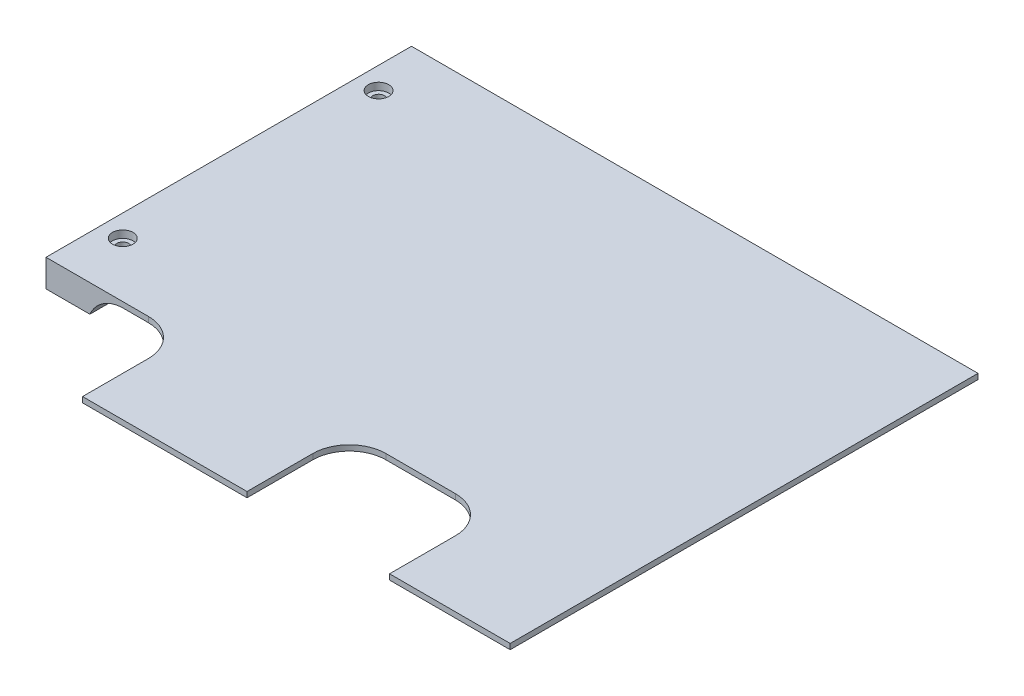
ISO-10303-21;
HEADER;
FILE_DESCRIPTION(('STEP AP214'),'2;1');
FILE_NAME('part.step','',(''),(''),'','','');
FILE_SCHEMA(('AUTOMOTIVE_DESIGN { 1 0 10303 214 1 1 1 1 }'));
ENDSEC;
DATA;
#1=APPLICATION_CONTEXT('core data for automotive mechanical design processes');
#2=APPLICATION_PROTOCOL_DEFINITION('international standard','automotive_design',2000,#1);
#3=PRODUCT_CONTEXT('',#1,'mechanical');
#4=PRODUCT('Part','Part','',(#3));
#5=PRODUCT_RELATED_PRODUCT_CATEGORY('part','',(#4));
#6=PRODUCT_DEFINITION_FORMATION('','',#4);
#7=PRODUCT_DEFINITION_CONTEXT('part definition',#1,'design');
#8=PRODUCT_DEFINITION('design','',#6,#7);
#9=PRODUCT_DEFINITION_SHAPE('','',#8);
#10=(LENGTH_UNIT() NAMED_UNIT(*) SI_UNIT(.MILLI.,.METRE.));
#11=(NAMED_UNIT(*) PLANE_ANGLE_UNIT() SI_UNIT($,.RADIAN.));
#12=(NAMED_UNIT(*) SI_UNIT($,.STERADIAN.) SOLID_ANGLE_UNIT());
#13=UNCERTAINTY_MEASURE_WITH_UNIT(LENGTH_MEASURE(1.E-05),#10,'distance_accuracy_value','');
#14=(GEOMETRIC_REPRESENTATION_CONTEXT(3) GLOBAL_UNCERTAINTY_ASSIGNED_CONTEXT((#13)) GLOBAL_UNIT_ASSIGNED_CONTEXT((#10,
#11,#12)) REPRESENTATION_CONTEXT('',''));
#15=CARTESIAN_POINT('',(0.,0.,0.));
#16=DIRECTION('',(0.,0.,1.));
#17=DIRECTION('',(1.,0.,0.));
#18=AXIS2_PLACEMENT_3D('',#15,#16,#17);
#19=CARTESIAN_POINT('',(5.99999999999995,-4.52548339959391,-15.));
#20=DIRECTION('',(0.,1.,0.));
#21=DIRECTION('',(0.,0.,1.));
#22=AXIS2_PLACEMENT_3D('',#19,#20,#21);
#23=CYLINDRICAL_SURFACE('',#22,1.6);
#24=CARTESIAN_POINT('',(5.99999999999995,-6.,-15.));
#25=DIRECTION('',(0.,-1.,0.));
#26=DIRECTION('',(0.,0.,-1.));
#27=AXIS2_PLACEMENT_3D('',#24,#25,#26);
#28=CIRCLE('',#27,1.6);
#29=CARTESIAN_POINT('',(5.99999999999995,-6.,-13.4));
#30=VERTEX_POINT('',#29);
#31=EDGE_CURVE('E222',#30,#30,#28,.T.);
#32=CARTESIAN_POINT('',(5.99999999999995,-0.5,-15.));
#33=DIRECTION('',(0.,1.,0.));
#34=DIRECTION('',(0.,0.,1.));
#35=AXIS2_PLACEMENT_3D('',#32,#33,#34);
#36=CIRCLE('',#35,1.6);
#37=CARTESIAN_POINT('',(5.99999999999995,-0.500000000000001,-13.4));
#38=VERTEX_POINT('',#37);
#39=EDGE_CURVE('E43',#38,#38,#36,.F.);
#40=CARTESIAN_POINT('',(5.99999999999995,-6.,-13.4));
#41=CARTESIAN_POINT('',(5.99999999999995,-5.94270833333333,-13.4));
#42=CARTESIAN_POINT('',(5.99999999999995,-5.88541666666667,-13.4));
#43=CARTESIAN_POINT('',(5.99999999999995,-5.77083333333333,-13.4));
#44=CARTESIAN_POINT('',(5.99999999999995,-5.71354166666667,-13.4));
#45=CARTESIAN_POINT('',(5.99999999999995,-5.59895833333333,-13.4));
#46=CARTESIAN_POINT('',(5.99999999999995,-5.54166666666667,-13.4));
#47=CARTESIAN_POINT('',(5.99999999999995,-5.42708333333333,-13.4));
#48=CARTESIAN_POINT('',(5.99999999999995,-5.36979166666667,-13.4));
#49=CARTESIAN_POINT('',(5.99999999999995,-5.25520833333333,-13.4));
#50=CARTESIAN_POINT('',(5.99999999999995,-5.19791666666667,-13.4));
#51=CARTESIAN_POINT('',(5.99999999999995,-5.08333333333333,-13.4));
#52=CARTESIAN_POINT('',(5.99999999999995,-5.02604166666667,-13.4));
#53=CARTESIAN_POINT('',(5.99999999999995,-4.91145833333333,-13.4));
#54=CARTESIAN_POINT('',(5.99999999999995,-4.85416666666667,-13.4));
#55=CARTESIAN_POINT('',(5.99999999999995,-4.73958333333333,-13.4));
#56=CARTESIAN_POINT('',(5.99999999999995,-4.68229166666667,-13.4));
#57=CARTESIAN_POINT('',(5.99999999999995,-4.56770833333333,-13.4));
#58=CARTESIAN_POINT('',(5.99999999999995,-4.51041666666667,-13.4));
#59=CARTESIAN_POINT('',(5.99999999999995,-4.39583333333333,-13.4));
#60=CARTESIAN_POINT('',(5.99999999999995,-4.33854166666667,-13.4));
#61=CARTESIAN_POINT('',(5.99999999999995,-4.22395833333333,-13.4));
#62=CARTESIAN_POINT('',(5.99999999999995,-4.16666666666667,-13.4));
#63=CARTESIAN_POINT('',(5.99999999999995,-4.05208333333333,-13.4));
#64=CARTESIAN_POINT('',(5.99999999999995,-3.99479166666667,-13.4));
#65=CARTESIAN_POINT('',(5.99999999999995,-3.88020833333333,-13.4));
#66=CARTESIAN_POINT('',(5.99999999999995,-3.82291666666667,-13.4));
#67=CARTESIAN_POINT('',(5.99999999999995,-3.70833333333333,-13.4));
#68=CARTESIAN_POINT('',(5.99999999999995,-3.65104166666667,-13.4));
#69=CARTESIAN_POINT('',(5.99999999999995,-3.53645833333333,-13.4));
#70=CARTESIAN_POINT('',(5.99999999999995,-3.47916666666667,-13.4));
#71=CARTESIAN_POINT('',(5.99999999999995,-3.36458333333333,-13.4));
#72=CARTESIAN_POINT('',(5.99999999999995,-3.30729166666667,-13.4));
#73=CARTESIAN_POINT('',(5.99999999999995,-3.19270833333333,-13.4));
#74=CARTESIAN_POINT('',(5.99999999999995,-3.13541666666667,-13.4));
#75=CARTESIAN_POINT('',(5.99999999999995,-3.02083333333333,-13.4));
#76=CARTESIAN_POINT('',(5.99999999999995,-2.96354166666667,-13.4));
#77=CARTESIAN_POINT('',(5.99999999999995,-2.84895833333333,-13.4));
#78=CARTESIAN_POINT('',(5.99999999999995,-2.79166666666667,-13.4));
#79=CARTESIAN_POINT('',(5.99999999999995,-2.67708333333333,-13.4));
#80=CARTESIAN_POINT('',(5.99999999999995,-2.61979166666667,-13.4));
#81=CARTESIAN_POINT('',(5.99999999999995,-2.50520833333333,-13.4));
#82=CARTESIAN_POINT('',(5.99999999999995,-2.44791666666667,-13.4));
#83=CARTESIAN_POINT('',(5.99999999999995,-2.33333333333333,-13.4));
#84=CARTESIAN_POINT('',(5.99999999999995,-2.27604166666667,-13.4));
#85=CARTESIAN_POINT('',(5.99999999999995,-2.16145833333333,-13.4));
#86=CARTESIAN_POINT('',(5.99999999999995,-2.10416666666667,-13.4));
#87=CARTESIAN_POINT('',(5.99999999999995,-1.98958333333333,-13.4));
#88=CARTESIAN_POINT('',(5.99999999999995,-1.93229166666667,-13.4));
#89=CARTESIAN_POINT('',(5.99999999999995,-1.81770833333333,-13.4));
#90=CARTESIAN_POINT('',(5.99999999999995,-1.76041666666667,-13.4));
#91=CARTESIAN_POINT('',(5.99999999999995,-1.64583333333333,-13.4));
#92=CARTESIAN_POINT('',(5.99999999999995,-1.58854166666667,-13.4));
#93=CARTESIAN_POINT('',(5.99999999999995,-1.47395833333333,-13.4));
#94=CARTESIAN_POINT('',(5.99999999999995,-1.41666666666667,-13.4));
#95=CARTESIAN_POINT('',(5.99999999999995,-1.30208333333333,-13.4));
#96=CARTESIAN_POINT('',(5.99999999999995,-1.24479166666667,-13.4));
#97=CARTESIAN_POINT('',(5.99999999999995,-1.13020833333333,-13.4));
#98=CARTESIAN_POINT('',(5.99999999999995,-1.07291666666667,-13.4));
#99=CARTESIAN_POINT('',(5.99999999999995,-0.958333333333334,-13.4));
#100=CARTESIAN_POINT('',(5.99999999999995,-0.901041666666667,-13.4));
#101=CARTESIAN_POINT('',(5.99999999999995,-0.786458333333334,-13.4));
#102=CARTESIAN_POINT('',(5.99999999999995,-0.729166666666667,-13.4));
#103=CARTESIAN_POINT('',(5.99999999999995,-0.614583333333334,-13.4));
#104=CARTESIAN_POINT('',(5.99999999999995,-0.557291666666668,-13.4));
#105=CARTESIAN_POINT('',(5.99999999999995,-0.500000000000001,-13.4));
#106=B_SPLINE_CURVE_WITH_KNOTS('',3,(#40,#41,#42,#43,#44,#45,#46,#47,#48,#49,#50,#51,#52,#53,
#54,#55,#56,#57,#58,#59,#60,#61,#62,#63,#64,#65,#66,#67,#68,#69,#70,#71,#72,#73,#74,#75,#76,#77,
#78,#79,#80,#81,#82,#83,#84,#85,#86,#87,#88,#89,#90,#91,#92,#93,#94,#95,#96,#97,#98,#99,#100,
#101,#102,#103,#104,#105),.UNSPECIFIED.,.F.,.F.,(4,2,2,2,2,2,2,2,2,2,2,2,2,2,2,2,2,2,2,2,2,2,2,
2,2,2,2,2,2,2,2,2,4),(0.,0.171874999999999,0.343749999999999,0.515625,0.6875,0.859375,1.03125,
1.203125,1.375,1.546875,1.71875,1.890625,2.0625,2.234375,2.40625,2.578125,2.75,2.921875,3.09375,
3.265625,3.4375,3.609375,3.78125,3.953125,4.125,4.296875,4.46875,4.640625,4.8125,4.984375,
5.15625,5.328125,5.5),.UNSPECIFIED.);
#107=EDGE_CURVE('BSEAM39',#30,#38,#106,.T.);
#108=ORIENTED_EDGE('',*,*,#31,.T.);
#109=ORIENTED_EDGE('',*,*,#39,.F.);
#110=ORIENTED_EDGE('',*,*,#107,.T.);
#111=ORIENTED_EDGE('',*,*,#107,.F.);
#112=EDGE_LOOP('',(#108,#110,#109,#111));
#113=FACE_BOUND('',#112,.T.);
#114=ADVANCED_FACE('F39',(#113),#23,.F.);
#115=CARTESIAN_POINT('',(5.99999999999995,-4.52548339959391,-85.));
#116=DIRECTION('',(0.,1.,0.));
#117=DIRECTION('',(0.,0.,1.));
#118=AXIS2_PLACEMENT_3D('',#115,#116,#117);
#119=CYLINDRICAL_SURFACE('',#118,1.6);
#120=CARTESIAN_POINT('',(5.99999999999995,-6.,-85.));
#121=DIRECTION('',(0.,-1.,0.));
#122=DIRECTION('',(0.,0.,-1.));
#123=AXIS2_PLACEMENT_3D('',#120,#121,#122);
#124=CIRCLE('',#123,1.60000000000001);
#125=CARTESIAN_POINT('',(5.99999999999995,-6.,-83.4));
#126=VERTEX_POINT('',#125);
#127=EDGE_CURVE('E219',#126,#126,#124,.T.);
#128=CARTESIAN_POINT('',(5.99999999999995,-0.5,-85.));
#129=DIRECTION('',(0.,1.,0.));
#130=DIRECTION('',(0.,0.,1.));
#131=AXIS2_PLACEMENT_3D('',#128,#129,#130);
#132=CIRCLE('',#131,1.6);
#133=CARTESIAN_POINT('',(5.99999999999995,-0.500000000000001,-83.4));
#134=VERTEX_POINT('',#133);
#135=EDGE_CURVE('E287',#134,#134,#132,.F.);
#136=CARTESIAN_POINT('',(5.99999999999995,-6.,-83.4));
#137=CARTESIAN_POINT('',(5.99999999999995,-5.94270833333333,-83.4));
#138=CARTESIAN_POINT('',(5.99999999999995,-5.88541666666667,-83.4));
#139=CARTESIAN_POINT('',(5.99999999999995,-5.77083333333333,-83.4));
#140=CARTESIAN_POINT('',(5.99999999999995,-5.71354166666667,-83.4));
#141=CARTESIAN_POINT('',(5.99999999999995,-5.59895833333333,-83.4));
#142=CARTESIAN_POINT('',(5.99999999999995,-5.54166666666667,-83.4));
#143=CARTESIAN_POINT('',(5.99999999999995,-5.42708333333333,-83.4));
#144=CARTESIAN_POINT('',(5.99999999999995,-5.36979166666667,-83.4));
#145=CARTESIAN_POINT('',(5.99999999999995,-5.25520833333333,-83.4));
#146=CARTESIAN_POINT('',(5.99999999999995,-5.19791666666667,-83.4));
#147=CARTESIAN_POINT('',(5.99999999999995,-5.08333333333333,-83.4));
#148=CARTESIAN_POINT('',(5.99999999999995,-5.02604166666667,-83.4));
#149=CARTESIAN_POINT('',(5.99999999999995,-4.91145833333333,-83.4));
#150=CARTESIAN_POINT('',(5.99999999999995,-4.85416666666667,-83.4));
#151=CARTESIAN_POINT('',(5.99999999999995,-4.73958333333333,-83.4));
#152=CARTESIAN_POINT('',(5.99999999999995,-4.68229166666667,-83.4));
#153=CARTESIAN_POINT('',(5.99999999999995,-4.56770833333333,-83.4));
#154=CARTESIAN_POINT('',(5.99999999999995,-4.51041666666667,-83.4));
#155=CARTESIAN_POINT('',(5.99999999999995,-4.39583333333333,-83.4));
#156=CARTESIAN_POINT('',(5.99999999999995,-4.33854166666667,-83.4));
#157=CARTESIAN_POINT('',(5.99999999999995,-4.22395833333333,-83.4));
#158=CARTESIAN_POINT('',(5.99999999999995,-4.16666666666667,-83.4));
#159=CARTESIAN_POINT('',(5.99999999999995,-4.05208333333333,-83.4));
#160=CARTESIAN_POINT('',(5.99999999999995,-3.99479166666667,-83.4));
#161=CARTESIAN_POINT('',(5.99999999999995,-3.88020833333333,-83.4));
#162=CARTESIAN_POINT('',(5.99999999999995,-3.82291666666667,-83.4));
#163=CARTESIAN_POINT('',(5.99999999999995,-3.70833333333333,-83.4));
#164=CARTESIAN_POINT('',(5.99999999999995,-3.65104166666667,-83.4));
#165=CARTESIAN_POINT('',(5.99999999999995,-3.53645833333333,-83.4));
#166=CARTESIAN_POINT('',(5.99999999999995,-3.47916666666667,-83.4));
#167=CARTESIAN_POINT('',(5.99999999999995,-3.36458333333333,-83.4));
#168=CARTESIAN_POINT('',(5.99999999999995,-3.30729166666667,-83.4));
#169=CARTESIAN_POINT('',(5.99999999999995,-3.19270833333333,-83.4));
#170=CARTESIAN_POINT('',(5.99999999999995,-3.13541666666667,-83.4));
#171=CARTESIAN_POINT('',(5.99999999999995,-3.02083333333333,-83.4));
#172=CARTESIAN_POINT('',(5.99999999999995,-2.96354166666667,-83.4));
#173=CARTESIAN_POINT('',(5.99999999999995,-2.84895833333333,-83.4));
#174=CARTESIAN_POINT('',(5.99999999999995,-2.79166666666667,-83.4));
#175=CARTESIAN_POINT('',(5.99999999999995,-2.67708333333333,-83.4));
#176=CARTESIAN_POINT('',(5.99999999999995,-2.61979166666667,-83.4));
#177=CARTESIAN_POINT('',(5.99999999999995,-2.50520833333333,-83.4));
#178=CARTESIAN_POINT('',(5.99999999999995,-2.44791666666667,-83.4));
#179=CARTESIAN_POINT('',(5.99999999999995,-2.33333333333333,-83.4));
#180=CARTESIAN_POINT('',(5.99999999999995,-2.27604166666667,-83.4));
#181=CARTESIAN_POINT('',(5.99999999999995,-2.16145833333333,-83.4));
#182=CARTESIAN_POINT('',(5.99999999999995,-2.10416666666667,-83.4));
#183=CARTESIAN_POINT('',(5.99999999999995,-1.98958333333333,-83.4));
#184=CARTESIAN_POINT('',(5.99999999999995,-1.93229166666667,-83.4));
#185=CARTESIAN_POINT('',(5.99999999999995,-1.81770833333333,-83.4));
#186=CARTESIAN_POINT('',(5.99999999999995,-1.76041666666667,-83.4));
#187=CARTESIAN_POINT('',(5.99999999999995,-1.64583333333333,-83.4));
#188=CARTESIAN_POINT('',(5.99999999999995,-1.58854166666667,-83.4));
#189=CARTESIAN_POINT('',(5.99999999999995,-1.47395833333333,-83.4));
#190=CARTESIAN_POINT('',(5.99999999999995,-1.41666666666667,-83.4));
#191=CARTESIAN_POINT('',(5.99999999999995,-1.30208333333333,-83.4));
#192=CARTESIAN_POINT('',(5.99999999999995,-1.24479166666667,-83.4));
#193=CARTESIAN_POINT('',(5.99999999999995,-1.13020833333333,-83.4));
#194=CARTESIAN_POINT('',(5.99999999999995,-1.07291666666667,-83.4));
#195=CARTESIAN_POINT('',(5.99999999999995,-0.958333333333334,-83.4));
#196=CARTESIAN_POINT('',(5.99999999999995,-0.901041666666667,-83.4));
#197=CARTESIAN_POINT('',(5.99999999999995,-0.786458333333334,-83.4));
#198=CARTESIAN_POINT('',(5.99999999999995,-0.729166666666667,-83.4));
#199=CARTESIAN_POINT('',(5.99999999999995,-0.614583333333334,-83.4));
#200=CARTESIAN_POINT('',(5.99999999999995,-0.557291666666668,-83.4));
#201=CARTESIAN_POINT('',(5.99999999999995,-0.500000000000001,-83.4));
#202=B_SPLINE_CURVE_WITH_KNOTS('',3,(#136,#137,#138,#139,#140,#141,#142,#143,#144,#145,#146,
#147,#148,#149,#150,#151,#152,#153,#154,#155,#156,#157,#158,#159,#160,#161,#162,#163,#164,#165,
#166,#167,#168,#169,#170,#171,#172,#173,#174,#175,#176,#177,#178,#179,#180,#181,#182,#183,#184,
#185,#186,#187,#188,#189,#190,#191,#192,#193,#194,#195,#196,#197,#198,#199,#200,#201),
.UNSPECIFIED.,.F.,.F.,(4,2,2,2,2,2,2,2,2,2,2,2,2,2,2,2,2,2,2,2,2,2,2,2,2,2,2,2,2,2,2,2,4),(0.,
0.171874999999999,0.343749999999999,0.515625,0.6875,0.859375,1.03125,1.203125,1.375,1.546875,
1.71875,1.890625,2.0625,2.234375,2.40625,2.578125,2.75,2.921875,3.09375,3.265625,3.4375,
3.609375,3.78125,3.953125,4.125,4.296875,4.46875,4.640625,4.8125,4.984375,5.15625,5.328125,5.5),.UNSPECIFIED.);
#203=EDGE_CURVE('BSEAM325',#126,#134,#202,.T.);
#204=ORIENTED_EDGE('',*,*,#127,.T.);
#205=ORIENTED_EDGE('',*,*,#135,.F.);
#206=ORIENTED_EDGE('',*,*,#203,.T.);
#207=ORIENTED_EDGE('',*,*,#203,.F.);
#208=EDGE_LOOP('',(#204,#206,#205,#207));
#209=FACE_BOUND('',#208,.T.);
#210=ADVANCED_FACE('F325',(#209),#119,.F.);
#211=CARTESIAN_POINT('',(0.,1.5,0.));
#212=DIRECTION('',(0.,0.,-1.));
#213=DIRECTION('',(-1.,0.,0.));
#214=AXIS2_PLACEMENT_3D('',#211,#212,#213);
#215=PLANE('',#214);
#216=DIRECTION('',(1.,0.,0.));
#217=VECTOR('',#216,1.);
#218=CARTESIAN_POINT('',(0.,1.5,0.));
#219=LINE('',#218,#217);
#220=CARTESIAN_POINT('',(92.9999999999999,1.5,0.));
#221=VERTEX_POINT('',#220);
#222=CARTESIAN_POINT('',(112.,1.5,0.));
#223=VERTEX_POINT('',#222);
#224=EDGE_CURVE('E240',#221,#223,#219,.T.);
#225=ORIENTED_EDGE('',*,*,#224,.F.);
#226=DIRECTION('',(0.,1.,0.));
#227=VECTOR('',#226,1.);
#228=CARTESIAN_POINT('',(92.9999999999999,1.5,0.));
#229=LINE('',#228,#227);
#230=CARTESIAN_POINT('',(92.9999999999999,0.,0.));
#231=VERTEX_POINT('',#230);
#232=EDGE_CURVE('E267',#221,#231,#229,.F.);
#233=ORIENTED_EDGE('',*,*,#232,.T.);
#234=DIRECTION('',(1.,0.,0.));
#235=VECTOR('',#234,1.);
#236=CARTESIAN_POINT('',(0.,0.,0.));
#237=LINE('',#236,#235);
#238=CARTESIAN_POINT('',(112.,0.,0.));
#239=VERTEX_POINT('',#238);
#240=EDGE_CURVE('E237',#231,#239,#237,.T.);
#241=ORIENTED_EDGE('',*,*,#240,.T.);
#242=DIRECTION('',(0.,1.,0.));
#243=VECTOR('',#242,1.);
#244=CARTESIAN_POINT('',(112.,1.5,0.));
#245=LINE('',#244,#243);
#246=EDGE_CURVE('E264',#239,#223,#245,.T.);
#247=ORIENTED_EDGE('',*,*,#246,.T.);
#248=EDGE_LOOP('',(#225,#233,#241,#247));
#249=FACE_BOUND('',#248,.T.);
#250=ADVANCED_FACE('F330',(#249),#215,.F.);
#251=CARTESIAN_POINT('',(0.,1.5,0.));
#252=DIRECTION('',(1.,0.,0.));
#253=DIRECTION('',(0.,0.,-1.));
#254=AXIS2_PLACEMENT_3D('',#251,#252,#253);
#255=PLANE('',#254);
#256=DIRECTION('',(0.,-1.,0.));
#257=VECTOR('',#256,1.);
#258=CARTESIAN_POINT('',(0.,1.5,-100.));
#259=LINE('',#258,#257);
#260=CARTESIAN_POINT('',(0.,1.5,-100.));
#261=VERTEX_POINT('',#260);
#262=CARTESIAN_POINT('',(0.,-6.,-100.));
#263=VERTEX_POINT('',#262);
#264=EDGE_CURVE('E245',#261,#263,#259,.T.);
#265=ORIENTED_EDGE('',*,*,#264,.T.);
#266=DIRECTION('',(0.,0.,-1.));
#267=VECTOR('',#266,1.);
#268=CARTESIAN_POINT('',(0.,-6.,-100.));
#269=LINE('',#268,#267);
#270=CARTESIAN_POINT('',(0.,-6.,0.));
#271=VERTEX_POINT('',#270);
#272=EDGE_CURVE('E225',#271,#263,#269,.T.);
#273=ORIENTED_EDGE('',*,*,#272,.F.);
#274=DIRECTION('',(0.,-1.,0.));
#275=VECTOR('',#274,1.);
#276=CARTESIAN_POINT('',(0.,1.5,0.));
#277=LINE('',#276,#275);
#278=CARTESIAN_POINT('',(0.,1.5,0.));
#279=VERTEX_POINT('',#278);
#280=EDGE_CURVE('E253',#279,#271,#277,.T.);
#281=ORIENTED_EDGE('',*,*,#280,.F.);
#282=DIRECTION('',(0.,0.,1.));
#283=VECTOR('',#282,1.);
#284=CARTESIAN_POINT('',(0.,1.5,0.));
#285=LINE('',#284,#283);
#286=EDGE_CURVE('E238',#261,#279,#285,.T.);
#287=ORIENTED_EDGE('',*,*,#286,.F.);
#288=EDGE_LOOP('',(#265,#273,#281,#287));
#289=FACE_BOUND('',#288,.T.);
#290=ADVANCED_FACE('F387',(#289),#255,.F.);
#291=DIRECTION('',(-1.,0.,0.));
#292=VECTOR('',#291,1.);
#293=CARTESIAN_POINT('',(0.,-6.,0.));
#294=LINE('',#293,#292);
#295=CARTESIAN_POINT('',(11.9999999999999,-6.,0.));
#296=VERTEX_POINT('',#295);
#297=EDGE_CURVE('E234',#296,#271,#294,.T.);
#298=ORIENTED_EDGE('',*,*,#297,.F.);
#299=CARTESIAN_POINT('',(21.1651513899116,-10.,0.));
#300=DIRECTION('',(0.,0.,-1.));
#301=DIRECTION('',(-1.,0.,0.));
#302=AXIS2_PLACEMENT_3D('',#299,#300,#301);
#303=CIRCLE('',#302,10.);
#304=CARTESIAN_POINT('',(21.1651513899116,0.,0.));
#305=VERTEX_POINT('',#304);
#306=EDGE_CURVE('E48',#296,#305,#303,.T.);
#307=ORIENTED_EDGE('',*,*,#306,.T.);
#308=CARTESIAN_POINT('',(27.9999999999999,0.,0.));
#309=VERTEX_POINT('',#308);
#310=EDGE_CURVE('E246',#305,#309,#237,.T.);
#311=ORIENTED_EDGE('',*,*,#310,.T.);
#312=DIRECTION('',(0.,1.,0.));
#313=VECTOR('',#312,1.);
#314=CARTESIAN_POINT('',(27.9999999999999,1.5,0.));
#315=LINE('',#314,#313);
#316=CARTESIAN_POINT('',(27.9999999999999,1.5,0.));
#317=VERTEX_POINT('',#316);
#318=EDGE_CURVE('E255',#309,#317,#315,.T.);
#319=ORIENTED_EDGE('',*,*,#318,.T.);
#320=EDGE_CURVE('E164',#279,#317,#219,.T.);
#321=ORIENTED_EDGE('',*,*,#320,.F.);
#322=ORIENTED_EDGE('',*,*,#280,.T.);
#323=EDGE_LOOP('',(#298,#307,#311,#319,#321,#322));
#324=FACE_BOUND('',#323,.T.);
#325=ADVANCED_FACE('F390',(#324),#215,.F.);
#326=CARTESIAN_POINT('',(155.,1.5,0.));
#327=DIRECTION('',(-1.,0.,0.));
#328=DIRECTION('',(0.,0.,1.));
#329=AXIS2_PLACEMENT_3D('',#326,#327,#328);
#330=PLANE('',#329);
#331=DIRECTION('',(0.,0.,-1.));
#332=VECTOR('',#331,1.);
#333=CARTESIAN_POINT('',(155.,0.,0.));
#334=LINE('',#333,#332);
#335=CARTESIAN_POINT('',(155.,0.,28.));
#336=VERTEX_POINT('',#335);
#337=CARTESIAN_POINT('',(155.,0.,-100.));
#338=VERTEX_POINT('',#337);
#339=EDGE_CURVE('E248',#336,#338,#334,.T.);
#340=ORIENTED_EDGE('',*,*,#339,.T.);
#341=DIRECTION('',(0.,-1.,0.));
#342=VECTOR('',#341,1.);
#343=CARTESIAN_POINT('',(155.,1.5,-100.));
#344=LINE('',#343,#342);
#345=CARTESIAN_POINT('',(155.,1.5,-100.));
#346=VERTEX_POINT('',#345);
#347=EDGE_CURVE('E159',#346,#338,#344,.T.);
#348=ORIENTED_EDGE('',*,*,#347,.F.);
#349=DIRECTION('',(0.,0.,-1.));
#350=VECTOR('',#349,1.);
#351=CARTESIAN_POINT('',(155.,1.5,0.));
#352=LINE('',#351,#350);
#353=CARTESIAN_POINT('',(155.,1.5,28.));
#354=VERTEX_POINT('',#353);
#355=EDGE_CURVE('E153',#354,#346,#352,.T.);
#356=ORIENTED_EDGE('',*,*,#355,.F.);
#357=DIRECTION('',(0.,1.,0.));
#358=VECTOR('',#357,1.);
#359=CARTESIAN_POINT('',(155.,-53.,28.));
#360=LINE('',#359,#358);
#361=EDGE_CURVE('E156',#336,#354,#360,.T.);
#362=ORIENTED_EDGE('',*,*,#361,.F.);
#363=EDGE_LOOP('',(#340,#348,#356,#362));
#364=FACE_BOUND('',#363,.T.);
#365=ADVANCED_FACE('F155',(#364),#330,.F.);
#366=CARTESIAN_POINT('',(0.,1.5,-100.));
#367=DIRECTION('',(0.,0.,1.));
#368=DIRECTION('',(1.,0.,0.));
#369=AXIS2_PLACEMENT_3D('',#366,#367,#368);
#370=PLANE('',#369);
#371=DIRECTION('',(-1.,0.,0.));
#372=VECTOR('',#371,1.);
#373=CARTESIAN_POINT('',(0.,0.,-100.));
#374=LINE('',#373,#372);
#375=CARTESIAN_POINT('',(21.1651513899116,0.,-100.));
#376=VERTEX_POINT('',#375);
#377=EDGE_CURVE('E241',#338,#376,#374,.T.);
#378=ORIENTED_EDGE('',*,*,#377,.T.);
#379=CARTESIAN_POINT('',(21.1651513899116,-10.,-100.));
#380=DIRECTION('',(0.,0.,1.));
#381=DIRECTION('',(1.,0.,0.));
#382=AXIS2_PLACEMENT_3D('',#379,#380,#381);
#383=CIRCLE('',#382,10.);
#384=CARTESIAN_POINT('',(11.9999999999999,-6.,-100.));
#385=VERTEX_POINT('',#384);
#386=EDGE_CURVE('E11',#376,#385,#383,.T.);
#387=ORIENTED_EDGE('',*,*,#386,.T.);
#388=DIRECTION('',(1.,0.,0.));
#389=VECTOR('',#388,1.);
#390=CARTESIAN_POINT('',(0.,-6.,-100.));
#391=LINE('',#390,#389);
#392=EDGE_CURVE('E228',#263,#385,#391,.T.);
#393=ORIENTED_EDGE('',*,*,#392,.F.);
#394=ORIENTED_EDGE('',*,*,#264,.F.);
#395=DIRECTION('',(-1.,0.,0.));
#396=VECTOR('',#395,1.);
#397=CARTESIAN_POINT('',(0.,1.5,-100.));
#398=LINE('',#397,#396);
#399=EDGE_CURVE('E163',#346,#261,#398,.T.);
#400=ORIENTED_EDGE('',*,*,#399,.F.);
#401=ORIENTED_EDGE('',*,*,#347,.T.);
#402=EDGE_LOOP('',(#378,#387,#393,#394,#400,#401));
#403=FACE_BOUND('',#402,.T.);
#404=ADVANCED_FACE('F311',(#403),#370,.F.);
#405=CARTESIAN_POINT('',(0.,1.5,0.));
#406=DIRECTION('',(0.,-1.,0.));
#407=DIRECTION('',(0.,0.,-1.));
#408=AXIS2_PLACEMENT_3D('',#405,#406,#407);
#409=PLANE('',#408);
#410=CARTESIAN_POINT('',(5.99999999999995,1.5,-85.));
#411=DIRECTION('',(0.,1.,0.));
#412=DIRECTION('',(0.,0.,1.));
#413=AXIS2_PLACEMENT_3D('',#410,#411,#412);
#414=CIRCLE('',#413,2.8);
#415=CARTESIAN_POINT('',(5.99999999999995,1.5,-82.2));
#416=VERTEX_POINT('',#415);
#417=EDGE_CURVE('E294',#416,#416,#414,.T.);
#418=ORIENTED_EDGE('',*,*,#417,.F.);
#419=EDGE_LOOP('',(#418));
#420=FACE_BOUND('',#419,.T.);
#421=CARTESIAN_POINT('',(5.99999999999995,1.5,-15.));
#422=DIRECTION('',(0.,1.,0.));
#423=DIRECTION('',(0.,0.,1.));
#424=AXIS2_PLACEMENT_3D('',#421,#422,#423);
#425=CIRCLE('',#424,2.8);
#426=CARTESIAN_POINT('',(5.99999999999995,1.5,-12.2));
#427=VERTEX_POINT('',#426);
#428=EDGE_CURVE('E186',#427,#427,#425,.T.);
#429=ORIENTED_EDGE('',*,*,#428,.F.);
#430=EDGE_LOOP('',(#429));
#431=FACE_BOUND('',#430,.T.);
#432=ORIENTED_EDGE('',*,*,#286,.T.);
#433=ORIENTED_EDGE('',*,*,#320,.T.);
#434=CARTESIAN_POINT('',(27.9999999999999,1.5,10.));
#435=DIRECTION('',(0.,-1.,0.));
#436=DIRECTION('',(0.,0.,-1.));
#437=AXIS2_PLACEMENT_3D('',#434,#435,#436);
#438=CIRCLE('',#437,10.);
#439=CARTESIAN_POINT('',(37.9999999999999,1.5,10.));
#440=VERTEX_POINT('',#439);
#441=EDGE_CURVE('E271',#317,#440,#438,.T.);
#442=ORIENTED_EDGE('',*,*,#441,.T.);
#443=DIRECTION('',(0.,0.,1.));
#444=VECTOR('',#443,1.);
#445=CARTESIAN_POINT('',(37.9999999999999,1.5,0.));
#446=LINE('',#445,#444);
#447=CARTESIAN_POINT('',(37.9999999999999,1.5,28.));
#448=VERTEX_POINT('',#447);
#449=EDGE_CURVE('E173',#440,#448,#446,.T.);
#450=ORIENTED_EDGE('',*,*,#449,.T.);
#451=DIRECTION('',(1.,0.,0.));
#452=VECTOR('',#451,1.);
#453=CARTESIAN_POINT('',(37.9999999999999,1.5,28.));
#454=LINE('',#453,#452);
#455=CARTESIAN_POINT('',(82.9999999999999,1.5,28.));
#456=VERTEX_POINT('',#455);
#457=EDGE_CURVE('E196',#448,#456,#454,.T.);
#458=ORIENTED_EDGE('',*,*,#457,.T.);
#459=DIRECTION('',(0.,0.,-1.));
#460=VECTOR('',#459,1.);
#461=CARTESIAN_POINT('',(82.9999999999999,1.5,0.));
#462=LINE('',#461,#460);
#463=CARTESIAN_POINT('',(82.9999999999999,1.5,10.));
#464=VERTEX_POINT('',#463);
#465=EDGE_CURVE('E191',#456,#464,#462,.T.);
#466=ORIENTED_EDGE('',*,*,#465,.T.);
#467=CARTESIAN_POINT('',(92.9999999999999,1.5,10.));
#468=DIRECTION('',(0.,-1.,0.));
#469=DIRECTION('',(0.,0.,-1.));
#470=AXIS2_PLACEMENT_3D('',#467,#468,#469);
#471=CIRCLE('',#470,10.);
#472=EDGE_CURVE('E278',#464,#221,#471,.T.);
#473=ORIENTED_EDGE('',*,*,#472,.T.);
#474=ORIENTED_EDGE('',*,*,#224,.T.);
#475=CARTESIAN_POINT('',(112.,1.5,10.));
#476=DIRECTION('',(0.,-1.,0.));
#477=DIRECTION('',(0.,0.,-1.));
#478=AXIS2_PLACEMENT_3D('',#475,#476,#477);
#479=CIRCLE('',#478,10.);
#480=CARTESIAN_POINT('',(122.,1.5,10.));
#481=VERTEX_POINT('',#480);
#482=EDGE_CURVE('E282',#223,#481,#479,.T.);
#483=ORIENTED_EDGE('',*,*,#482,.T.);
#484=DIRECTION('',(0.,0.,1.));
#485=VECTOR('',#484,1.);
#486=CARTESIAN_POINT('',(122.,1.5,0.));
#487=LINE('',#486,#485);
#488=CARTESIAN_POINT('',(122.,1.5,28.));
#489=VERTEX_POINT('',#488);
#490=EDGE_CURVE('E178',#481,#489,#487,.T.);
#491=ORIENTED_EDGE('',*,*,#490,.T.);
#492=DIRECTION('',(1.,0.,0.));
#493=VECTOR('',#492,1.);
#494=CARTESIAN_POINT('',(155.,1.5,28.));
#495=LINE('',#494,#493);
#496=EDGE_CURVE('E170',#489,#354,#495,.T.);
#497=ORIENTED_EDGE('',*,*,#496,.T.);
#498=ORIENTED_EDGE('',*,*,#355,.T.);
#499=ORIENTED_EDGE('',*,*,#399,.T.);
#500=EDGE_LOOP('',(#432,#433,#442,#450,#458,#466,#473,#474,#483,#491,#497,#498,#499));
#501=FACE_BOUND('',#500,.T.);
#502=ADVANCED_FACE('F176',(#420,#431,#501),#409,.F.);
#503=CARTESIAN_POINT('',(0.,0.,0.));
#504=DIRECTION('',(0.,-1.,0.));
#505=DIRECTION('',(0.,0.,-1.));
#506=AXIS2_PLACEMENT_3D('',#503,#504,#505);
#507=PLANE('',#506);
#508=ORIENTED_EDGE('',*,*,#310,.F.);
#509=DIRECTION('',(0.,0.,1.));
#510=VECTOR('',#509,1.);
#511=CARTESIAN_POINT('',(21.1651513899116,0.,-100.));
#512=LINE('',#511,#510);
#513=EDGE_CURVE('E62',#305,#376,#512,.F.);
#514=ORIENTED_EDGE('',*,*,#513,.T.);
#515=ORIENTED_EDGE('',*,*,#377,.F.);
#516=ORIENTED_EDGE('',*,*,#339,.F.);
#517=DIRECTION('',(1.,0.,0.));
#518=VECTOR('',#517,1.);
#519=CARTESIAN_POINT('',(155.,0.,28.));
#520=LINE('',#519,#518);
#521=CARTESIAN_POINT('',(122.,0.,28.));
#522=VERTEX_POINT('',#521);
#523=EDGE_CURVE('E172',#522,#336,#520,.T.);
#524=ORIENTED_EDGE('',*,*,#523,.F.);
#525=DIRECTION('',(0.,0.,1.));
#526=VECTOR('',#525,1.);
#527=CARTESIAN_POINT('',(122.,0.,0.));
#528=LINE('',#527,#526);
#529=CARTESIAN_POINT('',(122.,0.,10.));
#530=VERTEX_POINT('',#529);
#531=EDGE_CURVE('E180',#530,#522,#528,.T.);
#532=ORIENTED_EDGE('',*,*,#531,.F.);
#533=CARTESIAN_POINT('',(112.,0.,10.));
#534=DIRECTION('',(0.,-1.,0.));
#535=DIRECTION('',(0.,0.,-1.));
#536=AXIS2_PLACEMENT_3D('',#533,#534,#535);
#537=CIRCLE('',#536,10.);
#538=EDGE_CURVE('E284',#530,#239,#537,.F.);
#539=ORIENTED_EDGE('',*,*,#538,.T.);
#540=ORIENTED_EDGE('',*,*,#240,.F.);
#541=CARTESIAN_POINT('',(92.9999999999999,0.,10.));
#542=DIRECTION('',(0.,-1.,0.));
#543=DIRECTION('',(0.,0.,-1.));
#544=AXIS2_PLACEMENT_3D('',#541,#542,#543);
#545=CIRCLE('',#544,10.);
#546=CARTESIAN_POINT('',(82.9999999999999,0.,10.));
#547=VERTEX_POINT('',#546);
#548=EDGE_CURVE('E280',#231,#547,#545,.F.);
#549=ORIENTED_EDGE('',*,*,#548,.T.);
#550=DIRECTION('',(0.,0.,-1.));
#551=VECTOR('',#550,1.);
#552=CARTESIAN_POINT('',(82.9999999999999,0.,0.));
#553=LINE('',#552,#551);
#554=CARTESIAN_POINT('',(82.9999999999999,0.,28.));
#555=VERTEX_POINT('',#554);
#556=EDGE_CURVE('E210',#555,#547,#553,.T.);
#557=ORIENTED_EDGE('',*,*,#556,.F.);
#558=DIRECTION('',(1.,0.,0.));
#559=VECTOR('',#558,1.);
#560=CARTESIAN_POINT('',(37.9999999999999,0.,28.));
#561=LINE('',#560,#559);
#562=CARTESIAN_POINT('',(37.9999999999999,0.,28.));
#563=VERTEX_POINT('',#562);
#564=EDGE_CURVE('E195',#563,#555,#561,.T.);
#565=ORIENTED_EDGE('',*,*,#564,.F.);
#566=DIRECTION('',(0.,0.,1.));
#567=VECTOR('',#566,1.);
#568=CARTESIAN_POINT('',(37.9999999999999,0.,0.));
#569=LINE('',#568,#567);
#570=CARTESIAN_POINT('',(37.9999999999999,0.,10.));
#571=VERTEX_POINT('',#570);
#572=EDGE_CURVE('E206',#571,#563,#569,.T.);
#573=ORIENTED_EDGE('',*,*,#572,.F.);
#574=CARTESIAN_POINT('',(27.9999999999999,0.,10.));
#575=DIRECTION('',(0.,-1.,0.));
#576=DIRECTION('',(0.,0.,-1.));
#577=AXIS2_PLACEMENT_3D('',#574,#575,#576);
#578=CIRCLE('',#577,10.);
#579=EDGE_CURVE('E274',#571,#309,#578,.F.);
#580=ORIENTED_EDGE('',*,*,#579,.T.);
#581=EDGE_LOOP('',(#508,#514,#515,#516,#524,#532,#539,#540,#549,#557,#565,#573,#580));
#582=FACE_BOUND('',#581,.T.);
#583=ADVANCED_FACE('F310',(#582),#507,.T.);
#584=CARTESIAN_POINT('',(0.,-6.,0.));
#585=DIRECTION('',(0.,1.,0.));
#586=DIRECTION('',(0.,0.,1.));
#587=AXIS2_PLACEMENT_3D('',#584,#585,#586);
#588=PLANE('',#587);
#589=ORIENTED_EDGE('',*,*,#272,.T.);
#590=ORIENTED_EDGE('',*,*,#392,.T.);
#591=DIRECTION('',(0.,0.,1.));
#592=VECTOR('',#591,1.);
#593=CARTESIAN_POINT('',(11.9999999999999,-6.,-100.));
#594=LINE('',#593,#592);
#595=EDGE_CURVE('E231',#385,#296,#594,.T.);
#596=ORIENTED_EDGE('',*,*,#595,.T.);
#597=ORIENTED_EDGE('',*,*,#297,.T.);
#598=EDGE_LOOP('',(#589,#590,#596,#597));
#599=FACE_BOUND('',#598,.T.);
#600=ORIENTED_EDGE('',*,*,#31,.F.);
#601=EDGE_LOOP('',(#600));
#602=FACE_BOUND('',#601,.T.);
#603=ORIENTED_EDGE('',*,*,#127,.F.);
#604=EDGE_LOOP('',(#603));
#605=FACE_BOUND('',#604,.T.);
#606=ADVANCED_FACE('F318',(#599,#602,#605),#588,.F.);
#607=CARTESIAN_POINT('',(37.9999999999999,-53.,28.));
#608=DIRECTION('',(0.,0.,1.));
#609=DIRECTION('',(1.,0.,0.));
#610=AXIS2_PLACEMENT_3D('',#607,#608,#609);
#611=PLANE('',#610);
#612=DIRECTION('',(0.,1.,0.));
#613=VECTOR('',#612,1.);
#614=CARTESIAN_POINT('',(37.9999999999999,-53.,28.));
#615=LINE('',#614,#613);
#616=EDGE_CURVE('E209',#563,#448,#615,.T.);
#617=ORIENTED_EDGE('',*,*,#616,.F.);
#618=ORIENTED_EDGE('',*,*,#564,.T.);
#619=DIRECTION('',(0.,1.,0.));
#620=VECTOR('',#619,1.);
#621=CARTESIAN_POINT('',(82.9999999999999,-53.,28.));
#622=LINE('',#621,#620);
#623=EDGE_CURVE('E205',#555,#456,#622,.T.);
#624=ORIENTED_EDGE('',*,*,#623,.T.);
#625=ORIENTED_EDGE('',*,*,#457,.F.);
#626=EDGE_LOOP('',(#617,#618,#624,#625));
#627=FACE_BOUND('',#626,.T.);
#628=ADVANCED_FACE('F337',(#627),#611,.T.);
#629=CARTESIAN_POINT('',(82.9999999999999,-53.,0.));
#630=DIRECTION('',(1.,0.,0.));
#631=DIRECTION('',(0.,0.,-1.));
#632=AXIS2_PLACEMENT_3D('',#629,#630,#631);
#633=PLANE('',#632);
#634=ORIENTED_EDGE('',*,*,#556,.T.);
#635=DIRECTION('',(0.,1.,0.));
#636=VECTOR('',#635,1.);
#637=CARTESIAN_POINT('',(82.9999999999999,-53.,10.));
#638=LINE('',#637,#636);
#639=EDGE_CURVE('E261',#547,#464,#638,.T.);
#640=ORIENTED_EDGE('',*,*,#639,.T.);
#641=ORIENTED_EDGE('',*,*,#465,.F.);
#642=ORIENTED_EDGE('',*,*,#623,.F.);
#643=EDGE_LOOP('',(#634,#640,#641,#642));
#644=FACE_BOUND('',#643,.T.);
#645=ADVANCED_FACE('F341',(#644),#633,.T.);
#646=CARTESIAN_POINT('',(37.9999999999999,-53.,0.));
#647=DIRECTION('',(-1.,0.,0.));
#648=DIRECTION('',(0.,0.,1.));
#649=AXIS2_PLACEMENT_3D('',#646,#647,#648);
#650=PLANE('',#649);
#651=ORIENTED_EDGE('',*,*,#449,.F.);
#652=DIRECTION('',(0.,1.,0.));
#653=VECTOR('',#652,1.);
#654=CARTESIAN_POINT('',(37.9999999999999,-53.,10.));
#655=LINE('',#654,#653);
#656=EDGE_CURVE('E258',#440,#571,#655,.F.);
#657=ORIENTED_EDGE('',*,*,#656,.T.);
#658=ORIENTED_EDGE('',*,*,#572,.T.);
#659=ORIENTED_EDGE('',*,*,#616,.T.);
#660=EDGE_LOOP('',(#651,#657,#658,#659));
#661=FACE_BOUND('',#660,.T.);
#662=ADVANCED_FACE('F345',(#661),#650,.T.);
#663=CARTESIAN_POINT('',(122.,-53.,0.));
#664=DIRECTION('',(-1.,0.,0.));
#665=DIRECTION('',(0.,0.,1.));
#666=AXIS2_PLACEMENT_3D('',#663,#664,#665);
#667=PLANE('',#666);
#668=ORIENTED_EDGE('',*,*,#490,.F.);
#669=DIRECTION('',(0.,1.,0.));
#670=VECTOR('',#669,1.);
#671=CARTESIAN_POINT('',(122.,-53.,10.));
#672=LINE('',#671,#670);
#673=EDGE_CURVE('E269',#481,#530,#672,.F.);
#674=ORIENTED_EDGE('',*,*,#673,.T.);
#675=ORIENTED_EDGE('',*,*,#531,.T.);
#676=DIRECTION('',(0.,1.,0.));
#677=VECTOR('',#676,1.);
#678=CARTESIAN_POINT('',(122.,-53.,28.));
#679=LINE('',#678,#677);
#680=EDGE_CURVE('E182',#522,#489,#679,.T.);
#681=ORIENTED_EDGE('',*,*,#680,.T.);
#682=EDGE_LOOP('',(#668,#674,#675,#681));
#683=FACE_BOUND('',#682,.T.);
#684=ADVANCED_FACE('F349',(#683),#667,.T.);
#685=CARTESIAN_POINT('',(155.,-53.,28.));
#686=DIRECTION('',(0.,0.,1.));
#687=DIRECTION('',(1.,0.,0.));
#688=AXIS2_PLACEMENT_3D('',#685,#686,#687);
#689=PLANE('',#688);
#690=ORIENTED_EDGE('',*,*,#680,.F.);
#691=ORIENTED_EDGE('',*,*,#523,.T.);
#692=ORIENTED_EDGE('',*,*,#361,.T.);
#693=ORIENTED_EDGE('',*,*,#496,.F.);
#694=EDGE_LOOP('',(#690,#691,#692,#693));
#695=FACE_BOUND('',#694,.T.);
#696=ADVANCED_FACE('F169',(#695),#689,.T.);
#697=CARTESIAN_POINT('',(27.9999999999999,1.5,10.));
#698=DIRECTION('',(0.,1.,0.));
#699=DIRECTION('',(0.,0.,1.));
#700=AXIS2_PLACEMENT_3D('',#697,#698,#699);
#701=CYLINDRICAL_SURFACE('',#700,10.);
#702=ORIENTED_EDGE('',*,*,#579,.F.);
#703=ORIENTED_EDGE('',*,*,#656,.F.);
#704=ORIENTED_EDGE('',*,*,#441,.F.);
#705=ORIENTED_EDGE('',*,*,#318,.F.);
#706=EDGE_LOOP('',(#702,#703,#704,#705));
#707=FACE_BOUND('',#706,.T.);
#708=ADVANCED_FACE('F356',(#707),#701,.F.);
#709=CARTESIAN_POINT('',(92.9999999999999,-53.,10.));
#710=DIRECTION('',(0.,1.,0.));
#711=DIRECTION('',(0.,0.,1.));
#712=AXIS2_PLACEMENT_3D('',#709,#710,#711);
#713=CYLINDRICAL_SURFACE('',#712,10.);
#714=ORIENTED_EDGE('',*,*,#548,.F.);
#715=ORIENTED_EDGE('',*,*,#232,.F.);
#716=ORIENTED_EDGE('',*,*,#472,.F.);
#717=ORIENTED_EDGE('',*,*,#639,.F.);
#718=EDGE_LOOP('',(#714,#715,#716,#717));
#719=FACE_BOUND('',#718,.T.);
#720=ADVANCED_FACE('F377',(#719),#713,.F.);
#721=CARTESIAN_POINT('',(112.,1.5,10.));
#722=DIRECTION('',(0.,1.,0.));
#723=DIRECTION('',(0.,0.,1.));
#724=AXIS2_PLACEMENT_3D('',#721,#722,#723);
#725=CYLINDRICAL_SURFACE('',#724,10.);
#726=ORIENTED_EDGE('',*,*,#538,.F.);
#727=ORIENTED_EDGE('',*,*,#673,.F.);
#728=ORIENTED_EDGE('',*,*,#482,.F.);
#729=ORIENTED_EDGE('',*,*,#246,.F.);
#730=EDGE_LOOP('',(#726,#727,#728,#729));
#731=FACE_BOUND('',#730,.T.);
#732=ADVANCED_FACE('F372',(#731),#725,.F.);
#733=CARTESIAN_POINT('',(21.1651513899116,-10.,-100.));
#734=DIRECTION('',(0.,0.,-1.));
#735=DIRECTION('',(-1.,0.,0.));
#736=AXIS2_PLACEMENT_3D('',#733,#734,#735);
#737=CYLINDRICAL_SURFACE('',#736,10.);
#738=ORIENTED_EDGE('',*,*,#386,.F.);
#739=ORIENTED_EDGE('',*,*,#513,.F.);
#740=ORIENTED_EDGE('',*,*,#306,.F.);
#741=ORIENTED_EDGE('',*,*,#595,.F.);
#742=EDGE_LOOP('',(#738,#739,#740,#741));
#743=FACE_BOUND('',#742,.T.);
#744=ADVANCED_FACE('F41',(#743),#737,.F.);
#745=CARTESIAN_POINT('',(5.99999999999995,-0.5,-85.));
#746=DIRECTION('',(0.,1.,0.));
#747=DIRECTION('',(0.,0.,1.));
#748=AXIS2_PLACEMENT_3D('',#745,#746,#747);
#749=PLANE('',#748);
#750=CARTESIAN_POINT('',(5.99999999999995,-0.5,-85.));
#751=DIRECTION('',(0.,1.,0.));
#752=DIRECTION('',(0.,0.,1.));
#753=AXIS2_PLACEMENT_3D('',#750,#751,#752);
#754=CIRCLE('',#753,2.8);
#755=CARTESIAN_POINT('',(5.99999999999995,-0.5,-82.2));
#756=VERTEX_POINT('',#755);
#757=EDGE_CURVE('E289',#756,#756,#754,.T.);
#758=ORIENTED_EDGE('',*,*,#757,.T.);
#759=EDGE_LOOP('',(#758));
#760=FACE_BOUND('',#759,.T.);
#761=ORIENTED_EDGE('',*,*,#135,.T.);
#762=EDGE_LOOP('',(#761));
#763=FACE_BOUND('',#762,.T.);
#764=ADVANCED_FACE('F366',(#760,#763),#749,.T.);
#765=CARTESIAN_POINT('',(5.99999999999995,-0.5,-85.));
#766=DIRECTION('',(0.,1.,0.));
#767=DIRECTION('',(0.,0.,1.));
#768=AXIS2_PLACEMENT_3D('',#765,#766,#767);
#769=CYLINDRICAL_SURFACE('',#768,2.8);
#770=ORIENTED_EDGE('',*,*,#757,.F.);
#771=EDGE_LOOP('',(#770));
#772=FACE_BOUND('',#771,.T.);
#773=ORIENTED_EDGE('',*,*,#417,.T.);
#774=EDGE_LOOP('',(#773));
#775=FACE_BOUND('',#774,.T.);
#776=ADVANCED_FACE('F363',(#772,#775),#769,.F.);
#777=CARTESIAN_POINT('',(5.99999999999995,-0.5,-15.));
#778=DIRECTION('',(0.,1.,0.));
#779=DIRECTION('',(0.,0.,1.));
#780=AXIS2_PLACEMENT_3D('',#777,#778,#779);
#781=PLANE('',#780);
#782=CARTESIAN_POINT('',(5.99999999999995,-0.5,-15.));
#783=DIRECTION('',(0.,1.,0.));
#784=DIRECTION('',(0.,0.,1.));
#785=AXIS2_PLACEMENT_3D('',#782,#783,#784);
#786=CIRCLE('',#785,2.8);
#787=CARTESIAN_POINT('',(5.99999999999995,-0.5,-12.2));
#788=VERTEX_POINT('',#787);
#789=EDGE_CURVE('E299',#788,#788,#786,.T.);
#790=ORIENTED_EDGE('',*,*,#789,.T.);
#791=EDGE_LOOP('',(#790));
#792=FACE_BOUND('',#791,.T.);
#793=ORIENTED_EDGE('',*,*,#39,.T.);
#794=EDGE_LOOP('',(#793));
#795=FACE_BOUND('',#794,.T.);
#796=ADVANCED_FACE('F359',(#792,#795),#781,.T.);
#797=CARTESIAN_POINT('',(5.99999999999995,-0.5,-15.));
#798=DIRECTION('',(0.,1.,0.));
#799=DIRECTION('',(0.,0.,1.));
#800=AXIS2_PLACEMENT_3D('',#797,#798,#799);
#801=CYLINDRICAL_SURFACE('',#800,2.8);
#802=ORIENTED_EDGE('',*,*,#789,.F.);
#803=EDGE_LOOP('',(#802));
#804=FACE_BOUND('',#803,.T.);
#805=ORIENTED_EDGE('',*,*,#428,.T.);
#806=EDGE_LOOP('',(#805));
#807=FACE_BOUND('',#806,.T.);
#808=ADVANCED_FACE('F307',(#804,#807),#801,.F.);
#809=CLOSED_SHELL('',(#114,#210,#250,#290,#325,#365,#404,#502,#583,#606,#628,#645,#662,#684,
#696,#708,#720,#732,#744,#764,#776,#796,#808));
#810=MANIFOLD_SOLID_BREP('B2',#809);
#811=ADVANCED_BREP_SHAPE_REPRESENTATION('',(#18,#810),#14);
#812=SHAPE_DEFINITION_REPRESENTATION(#9,#811);
ENDSEC;
END-ISO-10303-21;
